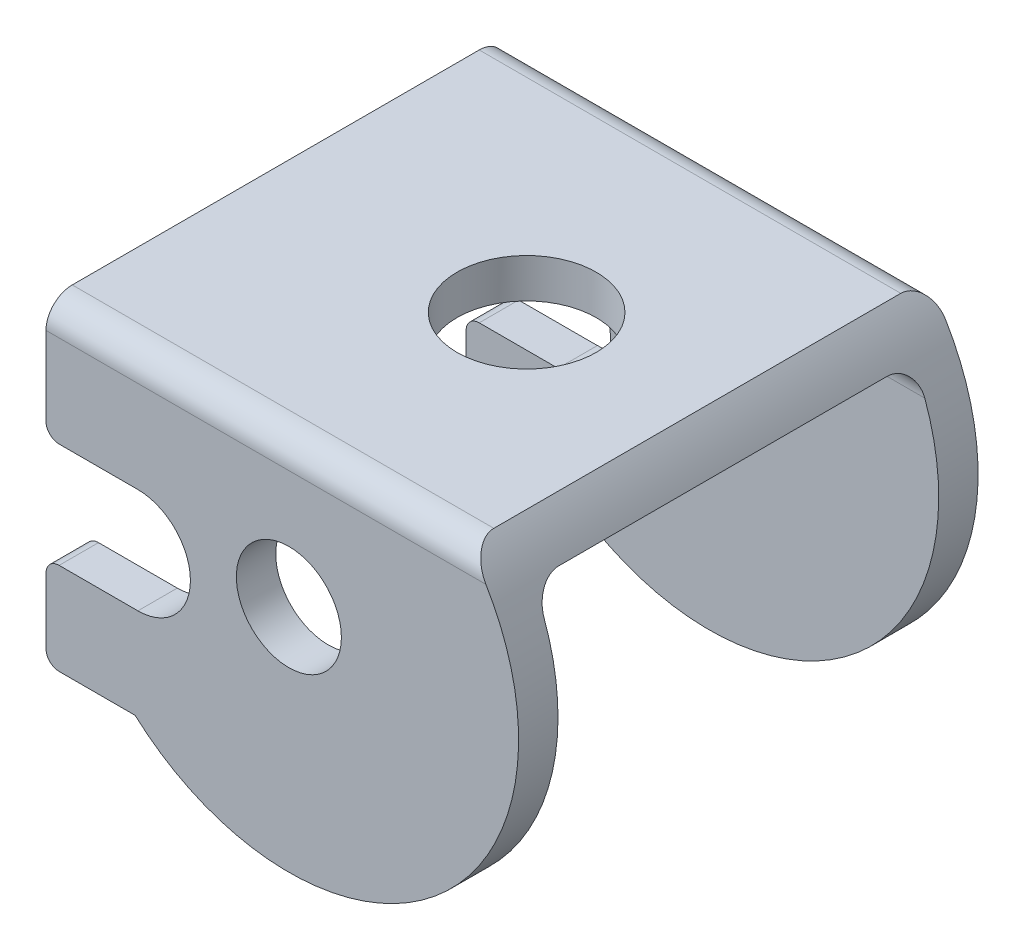
ISO-10303-21;
HEADER;
FILE_DESCRIPTION(('STEP AP214'),'2;1');
FILE_NAME('part.step','',(''),(''),'','','');
FILE_SCHEMA(('AUTOMOTIVE_DESIGN { 1 0 10303 214 1 1 1 1 }'));
ENDSEC;
DATA;
#1=APPLICATION_CONTEXT('core data for automotive mechanical design processes');
#2=APPLICATION_PROTOCOL_DEFINITION('international standard','automotive_design',2000,#1);
#3=PRODUCT_CONTEXT('',#1,'mechanical');
#4=PRODUCT('Part','Part','',(#3));
#5=PRODUCT_RELATED_PRODUCT_CATEGORY('part','',(#4));
#6=PRODUCT_DEFINITION_FORMATION('','',#4);
#7=PRODUCT_DEFINITION_CONTEXT('part definition',#1,'design');
#8=PRODUCT_DEFINITION('design','',#6,#7);
#9=PRODUCT_DEFINITION_SHAPE('','',#8);
#10=(LENGTH_UNIT() NAMED_UNIT(*) SI_UNIT(.MILLI.,.METRE.));
#11=(NAMED_UNIT(*) PLANE_ANGLE_UNIT() SI_UNIT($,.RADIAN.));
#12=(NAMED_UNIT(*) SI_UNIT($,.STERADIAN.) SOLID_ANGLE_UNIT());
#13=UNCERTAINTY_MEASURE_WITH_UNIT(LENGTH_MEASURE(1.E-05),#10,'distance_accuracy_value','');
#14=(GEOMETRIC_REPRESENTATION_CONTEXT(3) GLOBAL_UNCERTAINTY_ASSIGNED_CONTEXT((#13)) GLOBAL_UNIT_ASSIGNED_CONTEXT((#10,
#11,#12)) REPRESENTATION_CONTEXT('',''));
#15=CARTESIAN_POINT('',(0.,0.,0.));
#16=DIRECTION('',(0.,0.,1.));
#17=DIRECTION('',(1.,0.,0.));
#18=AXIS2_PLACEMENT_3D('',#15,#16,#17);
#19=CARTESIAN_POINT('',(-18.5,11.,17.5));
#20=DIRECTION('',(1.,0.,0.));
#21=DIRECTION('',(0.,1.,0.));
#22=AXIS2_PLACEMENT_3D('',#19,#20,#21);
#23=PLANE('',#22);
#24=DIRECTION('',(0.,-1.,0.));
#25=VECTOR('',#24,1.);
#26=CARTESIAN_POINT('',(-18.5,11.,-17.5));
#27=LINE('',#26,#25);
#28=CARTESIAN_POINT('',(-18.5,-7.,-17.5));
#29=VERTEX_POINT('',#28);
#30=CARTESIAN_POINT('',(-18.5,-12.,-17.5));
#31=VERTEX_POINT('',#30);
#32=EDGE_CURVE('E274',#29,#31,#27,.T.);
#33=ORIENTED_EDGE('',*,*,#32,.T.);
#34=DIRECTION('',(0.,0.,-1.));
#35=VECTOR('',#34,1.);
#36=CARTESIAN_POINT('',(-18.5,-12.,17.5));
#37=LINE('',#36,#35);
#38=CARTESIAN_POINT('',(-18.5,-12.,-14.5));
#39=VERTEX_POINT('',#38);
#40=EDGE_CURVE('E302',#31,#39,#37,.F.);
#41=ORIENTED_EDGE('',*,*,#40,.T.);
#42=DIRECTION('',(0.,-1.,0.));
#43=VECTOR('',#42,1.);
#44=CARTESIAN_POINT('',(-18.5,8.,-14.5));
#45=LINE('',#44,#43);
#46=CARTESIAN_POINT('',(-18.5,-7.,-14.5));
#47=VERTEX_POINT('',#46);
#48=EDGE_CURVE('E479',#47,#39,#45,.T.);
#49=ORIENTED_EDGE('',*,*,#48,.F.);
#50=DIRECTION('',(0.,0.,1.));
#51=VECTOR('',#50,1.);
#52=CARTESIAN_POINT('',(-18.5,-7.,17.5));
#53=LINE('',#52,#51);
#54=EDGE_CURVE('E300',#47,#29,#53,.F.);
#55=ORIENTED_EDGE('',*,*,#54,.T.);
#56=EDGE_LOOP('',(#33,#41,#49,#55));
#57=FACE_BOUND('',#56,.T.);
#58=ADVANCED_FACE('F33',(#57),#23,.F.);
#59=CARTESIAN_POINT('',(-18.5,-13.,17.5));
#60=DIRECTION('',(0.,1.,0.));
#61=DIRECTION('',(0.,0.,1.));
#62=AXIS2_PLACEMENT_3D('',#59,#60,#61);
#63=PLANE('',#62);
#64=DIRECTION('',(-1.,0.,0.));
#65=VECTOR('',#64,1.);
#66=CARTESIAN_POINT('',(-18.5,-13.,-14.5));
#67=LINE('',#66,#65);
#68=CARTESIAN_POINT('',(-11.71537451386,-13.,-14.5));
#69=VERTEX_POINT('',#68);
#70=CARTESIAN_POINT('',(-17.5,-13.,-14.5));
#71=VERTEX_POINT('',#70);
#72=EDGE_CURVE('E262',#69,#71,#67,.T.);
#73=ORIENTED_EDGE('',*,*,#72,.T.);
#74=DIRECTION('',(0.,0.,-1.));
#75=VECTOR('',#74,1.);
#76=CARTESIAN_POINT('',(-17.5,-13.,17.5));
#77=LINE('',#76,#75);
#78=CARTESIAN_POINT('',(-17.5,-13.,-17.5));
#79=VERTEX_POINT('',#78);
#80=EDGE_CURVE('E290',#71,#79,#77,.T.);
#81=ORIENTED_EDGE('',*,*,#80,.T.);
#82=DIRECTION('',(1.,0.,0.));
#83=VECTOR('',#82,1.);
#84=CARTESIAN_POINT('',(-18.5,-13.,-17.5));
#85=LINE('',#84,#83);
#86=CARTESIAN_POINT('',(-11.71537451386,-13.,-17.5));
#87=VERTEX_POINT('',#86);
#88=EDGE_CURVE('E273',#79,#87,#85,.T.);
#89=ORIENTED_EDGE('',*,*,#88,.T.);
#90=DIRECTION('',(0.,0.,-1.));
#91=VECTOR('',#90,1.);
#92=CARTESIAN_POINT('',(-11.71537451386,-13.,17.5));
#93=LINE('',#92,#91);
#94=EDGE_CURVE('E280',#69,#87,#93,.T.);
#95=ORIENTED_EDGE('',*,*,#94,.F.);
#96=EDGE_LOOP('',(#73,#81,#89,#95));
#97=FACE_BOUND('',#96,.T.);
#98=ADVANCED_FACE('F414',(#97),#63,.F.);
#99=CARTESIAN_POINT('',(0.,0.,-17.5));
#100=DIRECTION('',(0.,0.,1.));
#101=DIRECTION('',(1.,0.,0.));
#102=AXIS2_PLACEMENT_3D('',#99,#100,#101);
#103=CYLINDRICAL_SURFACE('',#102,4.);
#104=CARTESIAN_POINT('',(0.,0.,-14.5));
#105=DIRECTION('',(0.,0.,-1.));
#106=DIRECTION('',(0.,1.,0.));
#107=AXIS2_PLACEMENT_3D('',#104,#105,#106);
#108=CIRCLE('',#107,4.);
#109=CARTESIAN_POINT('',(0.,4.,-14.5));
#110=VERTEX_POINT('',#109);
#111=EDGE_CURVE('E500',#110,#110,#108,.F.);
#112=ORIENTED_EDGE('',*,*,#111,.T.);
#113=EDGE_LOOP('',(#112));
#114=FACE_BOUND('',#113,.T.);
#115=CARTESIAN_POINT('',(0.,0.,-17.5));
#116=DIRECTION('',(0.,0.,1.));
#117=DIRECTION('',(1.,0.,0.));
#118=AXIS2_PLACEMENT_3D('',#115,#116,#117);
#119=CIRCLE('',#118,4.);
#120=CARTESIAN_POINT('',(4.,0.,-17.5));
#121=VERTEX_POINT('',#120);
#122=EDGE_CURVE('E256',#121,#121,#119,.T.);
#123=ORIENTED_EDGE('',*,*,#122,.F.);
#124=EDGE_LOOP('',(#123));
#125=FACE_BOUND('',#124,.T.);
#126=ADVANCED_FACE('F421',(#114,#125),#103,.F.);
#127=CARTESIAN_POINT('',(-18.5,2.,-17.5));
#128=DIRECTION('',(0.,1.,0.));
#129=DIRECTION('',(0.,0.,1.));
#130=AXIS2_PLACEMENT_3D('',#127,#128,#129);
#131=PLANE('',#130);
#132=DIRECTION('',(-1.,0.,0.));
#133=VECTOR('',#132,1.);
#134=CARTESIAN_POINT('',(-18.5,2.,-14.5));
#135=LINE('',#134,#133);
#136=CARTESIAN_POINT('',(-11.5,2.,-14.5));
#137=VERTEX_POINT('',#136);
#138=CARTESIAN_POINT('',(-17.5,2.,-14.5));
#139=VERTEX_POINT('',#138);
#140=EDGE_CURVE('E497',#137,#139,#135,.T.);
#141=ORIENTED_EDGE('',*,*,#140,.T.);
#142=DIRECTION('',(0.,0.,1.));
#143=VECTOR('',#142,1.);
#144=CARTESIAN_POINT('',(-17.5,2.,-17.5));
#145=LINE('',#144,#143);
#146=CARTESIAN_POINT('',(-17.5,2.,-17.5));
#147=VERTEX_POINT('',#146);
#148=EDGE_CURVE('E339',#139,#147,#145,.F.);
#149=ORIENTED_EDGE('',*,*,#148,.T.);
#150=DIRECTION('',(-1.,0.,0.));
#151=VECTOR('',#150,1.);
#152=CARTESIAN_POINT('',(-18.5,2.,-17.5));
#153=LINE('',#152,#151);
#154=CARTESIAN_POINT('',(-11.5,2.,-17.5));
#155=VERTEX_POINT('',#154);
#156=EDGE_CURVE('E246',#155,#147,#153,.T.);
#157=ORIENTED_EDGE('',*,*,#156,.F.);
#158=DIRECTION('',(0.,0.,1.));
#159=VECTOR('',#158,1.);
#160=CARTESIAN_POINT('',(-11.5,2.,-17.5));
#161=LINE('',#160,#159);
#162=EDGE_CURVE('E254',#155,#137,#161,.T.);
#163=ORIENTED_EDGE('',*,*,#162,.T.);
#164=EDGE_LOOP('',(#141,#149,#157,#163));
#165=FACE_BOUND('',#164,.T.);
#166=ADVANCED_FACE('F559',(#165),#131,.F.);
#167=CARTESIAN_POINT('',(-11.5,-2.,-17.5));
#168=DIRECTION('',(0.,0.,1.));
#169=DIRECTION('',(1.,0.,0.));
#170=AXIS2_PLACEMENT_3D('',#167,#168,#169);
#171=CYLINDRICAL_SURFACE('',#170,4.);
#172=DIRECTION('',(0.,0.,1.));
#173=VECTOR('',#172,1.);
#174=CARTESIAN_POINT('',(-11.5,-6.,-17.5));
#175=LINE('',#174,#173);
#176=CARTESIAN_POINT('',(-11.5,-6.,-17.5));
#177=VERTEX_POINT('',#176);
#178=CARTESIAN_POINT('',(-11.5,-6.,-14.5));
#179=VERTEX_POINT('',#178);
#180=EDGE_CURVE('E245',#177,#179,#175,.T.);
#181=ORIENTED_EDGE('',*,*,#180,.T.);
#182=CARTESIAN_POINT('',(-11.5,-2.,-14.5));
#183=DIRECTION('',(0.,0.,-1.));
#184=DIRECTION('',(0.,1.,0.));
#185=AXIS2_PLACEMENT_3D('',#182,#183,#184);
#186=CIRCLE('',#185,4.);
#187=EDGE_CURVE('E494',#179,#137,#186,.F.);
#188=ORIENTED_EDGE('',*,*,#187,.T.);
#189=ORIENTED_EDGE('',*,*,#162,.F.);
#190=CARTESIAN_POINT('',(-11.5,-2.,-17.5));
#191=DIRECTION('',(0.,0.,1.));
#192=DIRECTION('',(1.,0.,0.));
#193=AXIS2_PLACEMENT_3D('',#190,#191,#192);
#194=CIRCLE('',#193,4.);
#195=EDGE_CURVE('E250',#177,#155,#194,.T.);
#196=ORIENTED_EDGE('',*,*,#195,.F.);
#197=EDGE_LOOP('',(#181,#188,#189,#196));
#198=FACE_BOUND('',#197,.T.);
#199=ADVANCED_FACE('F556',(#198),#171,.F.);
#200=CARTESIAN_POINT('',(-18.5,-6.,-17.5));
#201=DIRECTION('',(0.,-1.,0.));
#202=DIRECTION('',(0.,0.,-1.));
#203=AXIS2_PLACEMENT_3D('',#200,#201,#202);
#204=PLANE('',#203);
#205=DIRECTION('',(1.,0.,0.));
#206=VECTOR('',#205,1.);
#207=CARTESIAN_POINT('',(-18.5,-6.,-17.5));
#208=LINE('',#207,#206);
#209=CARTESIAN_POINT('',(-17.5,-6.,-17.5));
#210=VERTEX_POINT('',#209);
#211=EDGE_CURVE('E507',#210,#177,#208,.T.);
#212=ORIENTED_EDGE('',*,*,#211,.F.);
#213=DIRECTION('',(0.,0.,1.));
#214=VECTOR('',#213,1.);
#215=CARTESIAN_POINT('',(-17.5,-6.,-17.5));
#216=LINE('',#215,#214);
#217=CARTESIAN_POINT('',(-17.5,-6.,-14.5));
#218=VERTEX_POINT('',#217);
#219=EDGE_CURVE('E328',#210,#218,#216,.T.);
#220=ORIENTED_EDGE('',*,*,#219,.T.);
#221=DIRECTION('',(1.,0.,0.));
#222=VECTOR('',#221,1.);
#223=CARTESIAN_POINT('',(-18.5,-6.,-14.5));
#224=LINE('',#223,#222);
#225=EDGE_CURVE('E229',#218,#179,#224,.T.);
#226=ORIENTED_EDGE('',*,*,#225,.T.);
#227=ORIENTED_EDGE('',*,*,#180,.F.);
#228=EDGE_LOOP('',(#212,#220,#226,#227));
#229=FACE_BOUND('',#228,.T.);
#230=ADVANCED_FACE('F427',(#229),#204,.F.);
#231=DIRECTION('',(0.,0.,-1.));
#232=VECTOR('',#231,1.);
#233=CARTESIAN_POINT('',(-18.5,11.,17.5));
#234=LINE('',#233,#232);
#235=CARTESIAN_POINT('',(-18.5,11.,15.5));
#236=VERTEX_POINT('',#235);
#237=CARTESIAN_POINT('',(-18.5,11.,-15.5));
#238=VERTEX_POINT('',#237);
#239=EDGE_CURVE('E230',#236,#238,#234,.T.);
#240=ORIENTED_EDGE('',*,*,#239,.T.);
#241=CARTESIAN_POINT('',(-18.5,9.,-15.5));
#242=DIRECTION('',(1.,0.,0.));
#243=DIRECTION('',(0.,1.,0.));
#244=AXIS2_PLACEMENT_3D('',#241,#242,#243);
#245=CIRCLE('',#244,2.);
#246=CARTESIAN_POINT('',(-18.5,9.,-17.5));
#247=VERTEX_POINT('',#246);
#248=EDGE_CURVE('E360',#238,#247,#245,.F.);
#249=ORIENTED_EDGE('',*,*,#248,.T.);
#250=CARTESIAN_POINT('',(-18.5,3.,-17.5));
#251=VERTEX_POINT('',#250);
#252=EDGE_CURVE('E271',#247,#251,#27,.T.);
#253=ORIENTED_EDGE('',*,*,#252,.T.);
#254=DIRECTION('',(0.,0.,1.));
#255=VECTOR('',#254,1.);
#256=CARTESIAN_POINT('',(-18.5,3.,17.5));
#257=LINE('',#256,#255);
#258=CARTESIAN_POINT('',(-18.5,3.,-14.5));
#259=VERTEX_POINT('',#258);
#260=EDGE_CURVE('E336',#251,#259,#257,.T.);
#261=ORIENTED_EDGE('',*,*,#260,.T.);
#262=CARTESIAN_POINT('',(-18.5,6.,-14.5));
#263=VERTEX_POINT('',#262);
#264=EDGE_CURVE('E475',#263,#259,#45,.T.);
#265=ORIENTED_EDGE('',*,*,#264,.F.);
#266=CARTESIAN_POINT('',(-18.5,6.,-12.5));
#267=DIRECTION('',(1.,0.,0.));
#268=DIRECTION('',(0.,1.,0.));
#269=AXIS2_PLACEMENT_3D('',#266,#267,#268);
#270=CIRCLE('',#269,2.);
#271=CARTESIAN_POINT('',(-18.5,8.,-12.5));
#272=VERTEX_POINT('',#271);
#273=EDGE_CURVE('E392',#263,#272,#270,.T.);
#274=ORIENTED_EDGE('',*,*,#273,.T.);
#275=DIRECTION('',(0.,0.,-1.));
#276=VECTOR('',#275,1.);
#277=CARTESIAN_POINT('',(-18.5,8.,-14.5));
#278=LINE('',#277,#276);
#279=CARTESIAN_POINT('',(-18.5,8.,12.5));
#280=VERTEX_POINT('',#279);
#281=EDGE_CURVE('E240',#280,#272,#278,.T.);
#282=ORIENTED_EDGE('',*,*,#281,.F.);
#283=CARTESIAN_POINT('',(-18.5,6.,12.5));
#284=DIRECTION('',(1.,0.,0.));
#285=DIRECTION('',(0.,1.,0.));
#286=AXIS2_PLACEMENT_3D('',#283,#284,#285);
#287=CIRCLE('',#286,2.);
#288=CARTESIAN_POINT('',(-18.5,6.,14.5));
#289=VERTEX_POINT('',#288);
#290=EDGE_CURVE('E47',#280,#289,#287,.T.);
#291=ORIENTED_EDGE('',*,*,#290,.T.);
#292=DIRECTION('',(0.,1.,0.));
#293=VECTOR('',#292,1.);
#294=CARTESIAN_POINT('',(-18.5,8.,14.5));
#295=LINE('',#294,#293);
#296=CARTESIAN_POINT('',(-18.5,3.,14.5));
#297=VERTEX_POINT('',#296);
#298=EDGE_CURVE('E443',#297,#289,#295,.T.);
#299=ORIENTED_EDGE('',*,*,#298,.F.);
#300=DIRECTION('',(0.,0.,1.));
#301=VECTOR('',#300,1.);
#302=CARTESIAN_POINT('',(-18.5,3.,17.5));
#303=LINE('',#302,#301);
#304=CARTESIAN_POINT('',(-18.5,3.,17.5));
#305=VERTEX_POINT('',#304);
#306=EDGE_CURVE('E333',#297,#305,#303,.T.);
#307=ORIENTED_EDGE('',*,*,#306,.T.);
#308=DIRECTION('',(0.,-1.,0.));
#309=VECTOR('',#308,1.);
#310=CARTESIAN_POINT('',(-18.5,11.,17.5));
#311=LINE('',#310,#309);
#312=CARTESIAN_POINT('',(-18.5,9.,17.5));
#313=VERTEX_POINT('',#312);
#314=EDGE_CURVE('E263',#313,#305,#311,.T.);
#315=ORIENTED_EDGE('',*,*,#314,.F.);
#316=CARTESIAN_POINT('',(-18.5,9.,15.5));
#317=DIRECTION('',(1.,0.,0.));
#318=DIRECTION('',(0.,1.,0.));
#319=AXIS2_PLACEMENT_3D('',#316,#317,#318);
#320=CIRCLE('',#319,2.);
#321=EDGE_CURVE('E358',#313,#236,#320,.F.);
#322=ORIENTED_EDGE('',*,*,#321,.T.);
#323=EDGE_LOOP('',(#240,#249,#253,#261,#265,#274,#282,#291,#299,#307,#315,#322));
#324=FACE_BOUND('',#323,.T.);
#325=ADVANCED_FACE('F416',(#324),#23,.F.);
#326=CARTESIAN_POINT('',(-18.5,11.,17.5));
#327=DIRECTION('',(0.,-1.,0.));
#328=DIRECTION('',(0.,0.,-1.));
#329=AXIS2_PLACEMENT_3D('',#326,#327,#328);
#330=PLANE('',#329);
#331=CARTESIAN_POINT('',(0.610657588816201,11.,0.));
#332=DIRECTION('',(0.,1.,0.));
#333=DIRECTION('',(0.,0.,1.));
#334=AXIS2_PLACEMENT_3D('',#331,#332,#333);
#335=CIRCLE('',#334,5.3);
#336=CARTESIAN_POINT('',(0.610657588816201,11.,5.3));
#337=VERTEX_POINT('',#336);
#338=EDGE_CURVE('E793',#337,#337,#335,.T.);
#339=ORIENTED_EDGE('',*,*,#338,.F.);
#340=EDGE_LOOP('',(#339));
#341=FACE_BOUND('',#340,.T.);
#342=DIRECTION('',(0.,0.,-1.));
#343=VECTOR('',#342,1.);
#344=CARTESIAN_POINT('',(13.6106575888162,11.,17.5));
#345=LINE('',#344,#343);
#346=CARTESIAN_POINT('',(13.6106575888162,11.,15.5));
#347=VERTEX_POINT('',#346);
#348=CARTESIAN_POINT('',(13.6106575888162,11.,-15.5));
#349=VERTEX_POINT('',#348);
#350=EDGE_CURVE('E270',#347,#349,#345,.T.);
#351=ORIENTED_EDGE('',*,*,#350,.T.);
#352=DIRECTION('',(-1.,0.,0.));
#353=VECTOR('',#352,1.);
#354=CARTESIAN_POINT('',(-18.5,11.,-15.5));
#355=LINE('',#354,#353);
#356=EDGE_CURVE('E355',#349,#238,#355,.T.);
#357=ORIENTED_EDGE('',*,*,#356,.T.);
#358=ORIENTED_EDGE('',*,*,#239,.F.);
#359=DIRECTION('',(-1.,0.,0.));
#360=VECTOR('',#359,1.);
#361=CARTESIAN_POINT('',(13.6106575888162,11.,15.5));
#362=LINE('',#361,#360);
#363=EDGE_CURVE('E353',#236,#347,#362,.F.);
#364=ORIENTED_EDGE('',*,*,#363,.T.);
#365=EDGE_LOOP('',(#351,#357,#358,#364));
#366=FACE_BOUND('',#365,.T.);
#367=ADVANCED_FACE('F426',(#341,#366),#330,.F.);
#368=CARTESIAN_POINT('',(-18.5,-12.,14.5));
#369=VERTEX_POINT('',#368);
#370=CARTESIAN_POINT('',(-18.5,-7.,14.5));
#371=VERTEX_POINT('',#370);
#372=EDGE_CURVE('E438',#369,#371,#295,.T.);
#373=ORIENTED_EDGE('',*,*,#372,.F.);
#374=DIRECTION('',(0.,0.,-1.));
#375=VECTOR('',#374,1.);
#376=CARTESIAN_POINT('',(-18.5,-12.,17.5));
#377=LINE('',#376,#375);
#378=CARTESIAN_POINT('',(-18.5,-12.,17.5));
#379=VERTEX_POINT('',#378);
#380=EDGE_CURVE('E320',#369,#379,#377,.F.);
#381=ORIENTED_EDGE('',*,*,#380,.T.);
#382=CARTESIAN_POINT('',(-18.5,-7.,17.5));
#383=VERTEX_POINT('',#382);
#384=EDGE_CURVE('E266',#383,#379,#311,.T.);
#385=ORIENTED_EDGE('',*,*,#384,.F.);
#386=DIRECTION('',(0.,0.,1.));
#387=VECTOR('',#386,1.);
#388=CARTESIAN_POINT('',(-18.5,-7.,17.5));
#389=LINE('',#388,#387);
#390=EDGE_CURVE('E318',#383,#371,#389,.F.);
#391=ORIENTED_EDGE('',*,*,#390,.T.);
#392=EDGE_LOOP('',(#373,#381,#385,#391));
#393=FACE_BOUND('',#392,.T.);
#394=ADVANCED_FACE('F417',(#393),#23,.F.);
#395=DIRECTION('',(1.,0.,0.));
#396=VECTOR('',#395,1.);
#397=CARTESIAN_POINT('',(-18.5,-13.,17.5));
#398=LINE('',#397,#396);
#399=CARTESIAN_POINT('',(-17.5,-13.,17.5));
#400=VERTEX_POINT('',#399);
#401=CARTESIAN_POINT('',(-11.71537451386,-13.,17.5));
#402=VERTEX_POINT('',#401);
#403=EDGE_CURVE('E265',#400,#402,#398,.T.);
#404=ORIENTED_EDGE('',*,*,#403,.F.);
#405=DIRECTION('',(0.,0.,-1.));
#406=VECTOR('',#405,1.);
#407=CARTESIAN_POINT('',(-17.5,-13.,17.5));
#408=LINE('',#407,#406);
#409=CARTESIAN_POINT('',(-17.5,-13.,14.5));
#410=VERTEX_POINT('',#409);
#411=EDGE_CURVE('E310',#400,#410,#408,.T.);
#412=ORIENTED_EDGE('',*,*,#411,.T.);
#413=DIRECTION('',(1.,0.,0.));
#414=VECTOR('',#413,1.);
#415=CARTESIAN_POINT('',(-18.5,-13.,14.5));
#416=LINE('',#415,#414);
#417=CARTESIAN_POINT('',(-11.71537451386,-13.,14.5));
#418=VERTEX_POINT('',#417);
#419=EDGE_CURVE('E454',#410,#418,#416,.T.);
#420=ORIENTED_EDGE('',*,*,#419,.T.);
#421=EDGE_CURVE('E281',#402,#418,#93,.T.);
#422=ORIENTED_EDGE('',*,*,#421,.F.);
#423=EDGE_LOOP('',(#404,#412,#420,#422));
#424=FACE_BOUND('',#423,.T.);
#425=ADVANCED_FACE('F378',(#424),#63,.F.);
#426=CARTESIAN_POINT('',(0.,0.,17.5));
#427=DIRECTION('',(0.,0.,-1.));
#428=DIRECTION('',(-1.,0.,0.));
#429=AXIS2_PLACEMENT_3D('',#426,#427,#428);
#430=CYLINDRICAL_SURFACE('',#429,17.5);
#431=CARTESIAN_POINT('',(0.,0.,-17.5));
#432=DIRECTION('',(0.,0.,1.));
#433=DIRECTION('',(1.,0.,0.));
#434=AXIS2_PLACEMENT_3D('',#431,#432,#433);
#435=CIRCLE('',#434,17.5);
#436=CARTESIAN_POINT('',(15.0083310198036,9.,-17.5));
#437=VERTEX_POINT('',#436);
#438=EDGE_CURVE('E276',#87,#437,#435,.T.);
#439=ORIENTED_EDGE('',*,*,#438,.T.);
#440=CARTESIAN_POINT('',(15.0083310198036,9.,-17.5));
#441=CARTESIAN_POINT('',(14.9645534082728,9.07301034031166,-17.4999877795924));
#442=CARTESIAN_POINT('',(14.9202705373197,9.14563915729806,-17.4960011471963));
#443=CARTESIAN_POINT('',(14.8310412260911,9.28963812176121,-17.4802450340336));
#444=CARTESIAN_POINT('',(14.786094772489,9.36100824389683,-17.4684753967561));
#445=CARTESIAN_POINT('',(14.6504576699669,9.5729914135972,-17.4216287763982));
#446=CARTESIAN_POINT('',(14.5592902222138,9.71094314927927,-17.3750163714708));
#447=CARTESIAN_POINT('',(14.387830871648,9.9630082584165,-17.257895576401));
#448=CARTESIAN_POINT('',(14.3072985150232,10.0781496952952,-17.1899147371398));
#449=CARTESIAN_POINT('',(14.1521235423909,10.2949035045676,-17.0301192450205));
#450=CARTESIAN_POINT('',(14.077466567997,10.3965493043065,-16.9383652070003));
#451=CARTESIAN_POINT('',(13.9577809805876,10.5563945077046,-16.7600725509851));
#452=CARTESIAN_POINT('',(13.9102457681383,10.6188598616597,-16.6790198213369));
#453=CARTESIAN_POINT('',(13.8230708086961,10.7320921473302,-16.5052697006159));
#454=CARTESIAN_POINT('',(13.7834222024338,10.782872215668,-16.4125855686076));
#455=CARTESIAN_POINT('',(13.7202099441553,10.8631502915543,-16.2326520536976));
#456=CARTESIAN_POINT('',(13.6950900453614,10.8947499943016,-16.146889304263));
#457=CARTESIAN_POINT('',(13.6540086786241,10.9461931841439,-15.9698719301037));
#458=CARTESIAN_POINT('',(13.6380294385676,10.9660594868605,-15.8786283462376));
#459=CARTESIAN_POINT('',(13.6217478026285,10.9862667623627,-15.7387970052618));
#460=CARTESIAN_POINT('',(13.6176003801108,10.9914052871943,-15.6912877779798));
#461=CARTESIAN_POINT('',(13.61205222431,10.9982745431492,-15.595861750433));
#462=CARTESIAN_POINT('',(13.6106516878771,11.0000050300423,-15.5479449212053));
#463=CARTESIAN_POINT('',(13.6106575888162,11.,-15.5));
#464=B_SPLINE_CURVE_WITH_KNOTS('',3,(#440,#441,#442,#443,#444,#445,#446,#447,#448,#449,#450,
#451,#452,#453,#454,#455,#456,#457,#458,#459,#460,#461,#462,#463),.UNSPECIFIED.,.F.,.F.,(4,2,2,
2,2,2,2,2,2,2,2,4),(0.,0.255166405762982,0.510337942903821,1.0225224796022,1.48862069233795,
1.95354198706919,2.29080294644914,2.62768288361034,2.91089237958412,3.19354934537217,
3.33726869032789,3.48099833427564),.UNSPECIFIED.);
#465=EDGE_CURVE('E367',#437,#349,#464,.T.);
#466=ORIENTED_EDGE('',*,*,#465,.T.);
#467=ORIENTED_EDGE('',*,*,#350,.F.);
#468=CARTESIAN_POINT('',(13.6106575888162,11.,15.5));
#469=CARTESIAN_POINT('',(13.6106468465772,11.0000105496757,15.5479831027174));
#470=CARTESIAN_POINT('',(13.612052825652,10.9982735696029,15.5959582129971));
#471=CARTESIAN_POINT('',(13.6176160621449,10.9913860974259,15.6914713559368));
#472=CARTESIAN_POINT('',(13.6217715019022,10.9862378604908,15.7390096563335));
#473=CARTESIAN_POINT('',(13.6327113219535,10.9726593357704,15.8329458300312));
#474=CARTESIAN_POINT('',(13.6394761450401,10.9642534616704,15.8793495189758));
#475=CARTESIAN_POINT('',(13.6554859009043,10.9443075799741,15.9710330917056));
#476=CARTESIAN_POINT('',(13.6647311303355,10.9327671974922,16.0163128403609));
#477=CARTESIAN_POINT('',(13.6958801767708,10.8937586048742,16.149796509575));
#478=CARTESIAN_POINT('',(13.7212352991921,10.86185641496,16.2359561179349));
#479=CARTESIAN_POINT('',(13.7795210316588,10.7878179753847,16.4010768693606));
#480=CARTESIAN_POINT('',(13.8124674681899,10.7456603346193,16.4800224855417));
#481=CARTESIAN_POINT('',(13.8961311393038,10.6373685181619,16.6544457657481));
#482=CARTESIAN_POINT('',(13.9491243873168,10.5679135208077,16.7467775076532));
#483=CARTESIAN_POINT('',(14.0621750140902,10.4170121619937,16.9159689606591));
#484=CARTESIAN_POINT('',(14.1222404973257,10.3355520157261,16.9928106420147));
#485=CARTESIAN_POINT('',(14.2475401181812,10.1621441794972,17.131531759706));
#486=CARTESIAN_POINT('',(14.3128295414652,10.0700779788351,17.1932118726125));
#487=CARTESIAN_POINT('',(14.4457337603079,9.87848178903065,17.3000838271274));
#488=CARTESIAN_POINT('',(14.5133478274605,9.77895412653636,17.3452807829782));
#489=CARTESIAN_POINT('',(14.6529252405824,9.56861801634556,17.420895665632));
#490=CARTESIAN_POINT('',(14.7249233291505,9.45749020367269,17.4503644397463));
#491=CARTESIAN_POINT('',(14.867855909088,9.23120736534117,17.4899014988013));
#492=CARTESIAN_POINT('',(14.9387905636612,9.11605296686619,17.4999727915221));
#493=CARTESIAN_POINT('',(15.0083310198036,9.,17.5));
#494=B_SPLINE_CURVE_WITH_KNOTS('',3,(#468,#469,#470,#471,#472,#473,#474,#475,#476,#477,#478,
#479,#480,#481,#482,#483,#484,#485,#486,#487,#488,#489,#490,#491,#492,#493),.UNSPECIFIED.,.F.,
.F.,(4,2,2,2,2,2,2,2,2,2,2,2,4),(0.,0.143884224286708,0.287673422035193,0.430405234278488,
0.573154124692177,0.857713271600705,1.14287112723005,1.52216569895172,1.90189923553747,
2.28638593763024,2.67075324302675,3.07625267937024,3.48168923376816),.UNSPECIFIED.);
#495=CARTESIAN_POINT('',(15.0083310198036,9.,17.5));
#496=VERTEX_POINT('',#495);
#497=EDGE_CURVE('E54',#347,#496,#494,.T.);
#498=ORIENTED_EDGE('',*,*,#497,.T.);
#499=CARTESIAN_POINT('',(0.,0.,17.5));
#500=DIRECTION('',(0.,0.,1.));
#501=DIRECTION('',(1.,0.,0.));
#502=AXIS2_PLACEMENT_3D('',#499,#500,#501);
#503=CIRCLE('',#502,17.5);
#504=EDGE_CURVE('E268',#402,#496,#503,.T.);
#505=ORIENTED_EDGE('',*,*,#504,.F.);
#506=ORIENTED_EDGE('',*,*,#421,.T.);
#507=CARTESIAN_POINT('',(0.,0.,14.5));
#508=DIRECTION('',(0.,0.,1.));
#509=DIRECTION('',(0.,-1.,0.));
#510=AXIS2_PLACEMENT_3D('',#507,#508,#509);
#511=CIRCLE('',#510,17.5);
#512=CARTESIAN_POINT('',(16.4392822227736,6.00000000000001,14.5));
#513=VERTEX_POINT('',#512);
#514=EDGE_CURVE('E491',#418,#513,#511,.T.);
#515=ORIENTED_EDGE('',*,*,#514,.T.);
#516=CARTESIAN_POINT('',(16.4392822227736,6.00000000000001,14.5));
#517=CARTESIAN_POINT('',(16.4172269109751,6.06043468401717,14.499997609874));
#518=CARTESIAN_POINT('',(16.3948462847981,6.12071319611466,14.497259637975));
#519=CARTESIAN_POINT('',(16.3495926634499,6.24058600612827,14.4863898051146));
#520=CARTESIAN_POINT('',(16.3267197394568,6.30018040107121,14.478258718907));
#521=CARTESIAN_POINT('',(16.2576284887618,6.47730756746203,14.4459084145596));
#522=CARTESIAN_POINT('',(16.2109004937225,6.59328601766114,14.4137318837466));
#523=CARTESIAN_POINT('',(16.1178092334575,6.81769930699886,14.3291440712994));
#524=CARTESIAN_POINT('',(16.0714459793578,6.92613391680953,14.2767321748399));
#525=CARTESIAN_POINT('',(15.9809058946653,7.13255518813414,14.1528157800091));
#526=CARTESIAN_POINT('',(15.9367289912619,7.23054219770348,14.0813119179532));
#527=CARTESIAN_POINT('',(15.8530184381338,7.41227033070096,13.9212774574792));
#528=CARTESIAN_POINT('',(15.8134501941525,7.49612003773127,13.8328889225033));
#529=CARTESIAN_POINT('',(15.740856959433,7.64738352203996,13.6406480943489));
#530=CARTESIAN_POINT('',(15.7078301546021,7.71480185731765,13.5368001024689));
#531=CARTESIAN_POINT('',(15.6529625975252,7.82549085156232,13.3250345890196));
#532=CARTESIAN_POINT('',(15.6304469134525,7.87024243681698,13.2180776386848));
#533=CARTESIAN_POINT('',(15.6036653733771,7.92313101281914,13.0522208374665));
#534=CARTESIAN_POINT('',(15.595905420202,7.93838378788618,12.9960578107998));
#535=CARTESIAN_POINT('',(15.5828537036214,7.96397388312797,12.8823524675279));
#536=CARTESIAN_POINT('',(15.5775604856849,7.97431410010354,12.8248109848422));
#537=CARTESIAN_POINT('',(15.5705124933069,7.98806522270469,12.722676621708));
#538=CARTESIAN_POINT('',(15.5682154991806,7.99253939452775,12.6782599258364));
#539=CARTESIAN_POINT('',(15.5651499914437,7.99850664336416,12.5892312306071));
#540=CARTESIAN_POINT('',(15.5643795415305,8.00000349688347,12.5446195506892));
#541=CARTESIAN_POINT('',(15.5643824162734,8.00000000000001,12.5));
#542=B_SPLINE_CURVE_WITH_KNOTS('',3,(#516,#517,#518,#519,#520,#521,#522,#523,#524,#525,#526,
#527,#528,#529,#530,#531,#532,#533,#534,#535,#536,#537,#538,#539,#540,#541),.UNSPECIFIED.,.F.,
.F.,(4,2,2,2,2,2,2,2,2,2,2,2,4),(0.,0.19287380689744,0.385719912293615,0.771091411913085,
1.15647462146591,1.54184498819906,1.92410539491802,2.30625964307381,2.65839273320123,
2.83430314760535,3.01010970331713,3.14409168810323,3.27790361809354),.UNSPECIFIED.);
#543=CARTESIAN_POINT('',(15.5643824162734,8.00000000000001,12.5));
#544=VERTEX_POINT('',#543);
#545=EDGE_CURVE('E11',#513,#544,#542,.T.);
#546=ORIENTED_EDGE('',*,*,#545,.T.);
#547=DIRECTION('',(0.,0.,-1.));
#548=VECTOR('',#547,1.);
#549=CARTESIAN_POINT('',(15.5643824162734,8.00000000000001,17.5));
#550=LINE('',#549,#548);
#551=CARTESIAN_POINT('',(15.5643824162734,8.00000000000001,-12.5));
#552=VERTEX_POINT('',#551);
#553=EDGE_CURVE('E287',#544,#552,#550,.T.);
#554=ORIENTED_EDGE('',*,*,#553,.T.);
#555=CARTESIAN_POINT('',(15.5643824162734,8.00000000000001,-12.5));
#556=CARTESIAN_POINT('',(15.5643760249066,8.00000836466986,-12.5521306548815));
#557=CARTESIAN_POINT('',(15.565429880145,7.99796201184006,-12.604256115764));
#558=CARTESIAN_POINT('',(15.5696096602748,7.98982435223977,-12.708089719192));
#559=CARTESIAN_POINT('',(15.5727348911933,7.98373440019482,-12.7597979956361));
#560=CARTESIAN_POINT('',(15.5809922784606,7.96760671825372,-12.8622175990559));
#561=CARTESIAN_POINT('',(15.5861162430549,7.9575851012255,-12.9129321190703));
#562=CARTESIAN_POINT('',(15.5982769913274,7.93372128327986,-13.0132075152547));
#563=CARTESIAN_POINT('',(15.6053138633619,7.91987890588284,-13.0627683380213));
#564=CARTESIAN_POINT('',(15.6291166824584,7.87286211127509,-13.2091223580708));
#565=CARTESIAN_POINT('',(15.6485903833621,7.83416813889131,-13.3037732810296));
#566=CARTESIAN_POINT('',(15.6936028001465,7.74360212588611,-13.4849581075532));
#567=CARTESIAN_POINT('',(15.7191465163693,7.6917192180454,-13.5714852364973));
#568=CARTESIAN_POINT('',(15.7764504612658,7.57351516283824,-13.7389844261443));
#569=CARTESIAN_POINT('',(15.8084625488592,7.50658942993085,-13.8194430964984));
#570=CARTESIAN_POINT('',(15.8762961635755,7.36203745191937,-13.9682046255802));
#571=CARTESIAN_POINT('',(15.9121191010112,7.28440724215061,-14.0365029588552));
#572=CARTESIAN_POINT('',(15.9899773355718,7.11199239453678,-14.1662110231765));
#573=CARTESIAN_POINT('',(16.0322739184856,7.01626607399516,-14.2262138104442));
#574=CARTESIAN_POINT('',(16.1181873612254,6.81658755474057,-14.3291550283034));
#575=CARTESIAN_POINT('',(16.1618044015195,6.71263422847257,-14.3720911149391));
#576=CARTESIAN_POINT('',(16.2450984113127,6.50828720619884,-14.4370357680346));
#577=CARTESIAN_POINT('',(16.2847877661767,6.40837169341418,-14.4605410157883));
#578=CARTESIAN_POINT('',(16.3630793985492,6.20577787446,-14.4920303350473));
#579=CARTESIAN_POINT('',(16.4016822452881,6.10310107224752,-14.500022688881));
#580=CARTESIAN_POINT('',(16.4392822227736,6.00000000000001,-14.5));
#581=B_SPLINE_CURVE_WITH_KNOTS('',3,(#555,#556,#557,#558,#559,#560,#561,#562,#563,#564,#565,
#566,#567,#568,#569,#570,#571,#572,#573,#574,#575,#576,#577,#578,#579,#580),.UNSPECIFIED.,.F.,
.F.,(4,2,2,2,2,2,2,2,2,2,2,2,4),(0.,0.156332474129688,0.31261259865948,0.46825883167714,
0.623912255143662,0.93465870487193,1.2456620334067,1.57263497183098,1.89972933959439,
2.26008874467886,2.62049762475862,2.94952493935025,3.2783765380057),.UNSPECIFIED.);
#582=CARTESIAN_POINT('',(16.4392822227736,6.00000000000001,-14.5));
#583=VERTEX_POINT('',#582);
#584=EDGE_CURVE('E386',#552,#583,#581,.T.);
#585=ORIENTED_EDGE('',*,*,#584,.T.);
#586=CARTESIAN_POINT('',(0.,0.,-14.5));
#587=DIRECTION('',(0.,0.,-1.));
#588=DIRECTION('',(0.,1.,0.));
#589=AXIS2_PLACEMENT_3D('',#586,#587,#588);
#590=CIRCLE('',#589,17.5);
#591=EDGE_CURVE('E503',#583,#69,#590,.T.);
#592=ORIENTED_EDGE('',*,*,#591,.T.);
#593=ORIENTED_EDGE('',*,*,#94,.T.);
#594=EDGE_LOOP('',(#439,#466,#467,#498,#505,#506,#515,#546,#554,#585,#592,#593));
#595=FACE_BOUND('',#594,.T.);
#596=ADVANCED_FACE('F372',(#595),#430,.T.);
#597=CARTESIAN_POINT('',(0.,0.,17.5));
#598=DIRECTION('',(0.,0.,1.));
#599=DIRECTION('',(1.,0.,0.));
#600=AXIS2_PLACEMENT_3D('',#597,#598,#599);
#601=PLANE('',#600);
#602=ORIENTED_EDGE('',*,*,#504,.T.);
#603=DIRECTION('',(-1.,0.,0.));
#604=VECTOR('',#603,1.);
#605=CARTESIAN_POINT('',(-18.5,9.,17.5));
#606=LINE('',#605,#604);
#607=EDGE_CURVE('E459',#496,#313,#606,.T.);
#608=ORIENTED_EDGE('',*,*,#607,.T.);
#609=ORIENTED_EDGE('',*,*,#314,.T.);
#610=CARTESIAN_POINT('',(-17.5,3.,17.5));
#611=DIRECTION('',(0.,0.,1.));
#612=DIRECTION('',(1.,0.,0.));
#613=AXIS2_PLACEMENT_3D('',#610,#611,#612);
#614=CIRCLE('',#613,1.);
#615=CARTESIAN_POINT('',(-17.5,2.,17.5));
#616=VERTEX_POINT('',#615);
#617=EDGE_CURVE('E322',#305,#616,#614,.T.);
#618=ORIENTED_EDGE('',*,*,#617,.T.);
#619=DIRECTION('',(-1.,0.,0.));
#620=VECTOR('',#619,1.);
#621=CARTESIAN_POINT('',(-18.5,2.,17.5));
#622=LINE('',#621,#620);
#623=CARTESIAN_POINT('',(-11.5,2.,17.5));
#624=VERTEX_POINT('',#623);
#625=EDGE_CURVE('E509',#624,#616,#622,.T.);
#626=ORIENTED_EDGE('',*,*,#625,.F.);
#627=CARTESIAN_POINT('',(-11.5,-2.,17.5));
#628=DIRECTION('',(0.,0.,1.));
#629=DIRECTION('',(1.,0.,0.));
#630=AXIS2_PLACEMENT_3D('',#627,#628,#629);
#631=CIRCLE('',#630,4.);
#632=CARTESIAN_POINT('',(-11.5,-6.,17.5));
#633=VERTEX_POINT('',#632);
#634=EDGE_CURVE('E512',#633,#624,#631,.T.);
#635=ORIENTED_EDGE('',*,*,#634,.F.);
#636=DIRECTION('',(1.,0.,0.));
#637=VECTOR('',#636,1.);
#638=CARTESIAN_POINT('',(-18.5,-6.,17.5));
#639=LINE('',#638,#637);
#640=CARTESIAN_POINT('',(-17.5,-6.,17.5));
#641=VERTEX_POINT('',#640);
#642=EDGE_CURVE('E244',#641,#633,#639,.T.);
#643=ORIENTED_EDGE('',*,*,#642,.F.);
#644=CARTESIAN_POINT('',(-17.5,-7.,17.5));
#645=DIRECTION('',(0.,0.,1.));
#646=DIRECTION('',(1.,0.,0.));
#647=AXIS2_PLACEMENT_3D('',#644,#645,#646);
#648=CIRCLE('',#647,1.);
#649=EDGE_CURVE('E324',#641,#383,#648,.T.);
#650=ORIENTED_EDGE('',*,*,#649,.T.);
#651=ORIENTED_EDGE('',*,*,#384,.T.);
#652=CARTESIAN_POINT('',(-17.5,-12.,17.5));
#653=DIRECTION('',(0.,0.,1.));
#654=DIRECTION('',(1.,0.,0.));
#655=AXIS2_PLACEMENT_3D('',#652,#653,#654);
#656=CIRCLE('',#655,1.);
#657=EDGE_CURVE('E326',#379,#400,#656,.T.);
#658=ORIENTED_EDGE('',*,*,#657,.T.);
#659=ORIENTED_EDGE('',*,*,#403,.T.);
#660=EDGE_LOOP('',(#602,#608,#609,#618,#626,#635,#643,#650,#651,#658,#659));
#661=FACE_BOUND('',#660,.T.);
#662=CARTESIAN_POINT('',(0.,0.,17.5));
#663=DIRECTION('',(0.,0.,1.));
#664=DIRECTION('',(1.,0.,0.));
#665=AXIS2_PLACEMENT_3D('',#662,#663,#664);
#666=CIRCLE('',#665,4.);
#667=CARTESIAN_POINT('',(4.,0.,17.5));
#668=VERTEX_POINT('',#667);
#669=EDGE_CURVE('E259',#668,#668,#666,.T.);
#670=ORIENTED_EDGE('',*,*,#669,.F.);
#671=EDGE_LOOP('',(#670));
#672=FACE_BOUND('',#671,.T.);
#673=ADVANCED_FACE('F377',(#661,#672),#601,.T.);
#674=CARTESIAN_POINT('',(0.,0.,-17.5));
#675=DIRECTION('',(0.,0.,1.));
#676=DIRECTION('',(1.,0.,0.));
#677=AXIS2_PLACEMENT_3D('',#674,#675,#676);
#678=PLANE('',#677);
#679=ORIENTED_EDGE('',*,*,#122,.T.);
#680=EDGE_LOOP('',(#679));
#681=FACE_BOUND('',#680,.T.);
#682=ORIENTED_EDGE('',*,*,#252,.F.);
#683=DIRECTION('',(-1.,0.,0.));
#684=VECTOR('',#683,1.);
#685=CARTESIAN_POINT('',(0.,9.,-17.5));
#686=LINE('',#685,#684);
#687=EDGE_CURVE('E62',#247,#437,#686,.F.);
#688=ORIENTED_EDGE('',*,*,#687,.T.);
#689=ORIENTED_EDGE('',*,*,#438,.F.);
#690=ORIENTED_EDGE('',*,*,#88,.F.);
#691=CARTESIAN_POINT('',(-17.5,-12.,-17.5));
#692=DIRECTION('',(0.,0.,1.));
#693=DIRECTION('',(1.,0.,0.));
#694=AXIS2_PLACEMENT_3D('',#691,#692,#693);
#695=CIRCLE('',#694,1.);
#696=EDGE_CURVE('E298',#79,#31,#695,.F.);
#697=ORIENTED_EDGE('',*,*,#696,.T.);
#698=ORIENTED_EDGE('',*,*,#32,.F.);
#699=CARTESIAN_POINT('',(-17.5,-7.,-17.5));
#700=DIRECTION('',(0.,0.,1.));
#701=DIRECTION('',(1.,0.,0.));
#702=AXIS2_PLACEMENT_3D('',#699,#700,#701);
#703=CIRCLE('',#702,1.);
#704=EDGE_CURVE('E296',#29,#210,#703,.F.);
#705=ORIENTED_EDGE('',*,*,#704,.T.);
#706=ORIENTED_EDGE('',*,*,#211,.T.);
#707=ORIENTED_EDGE('',*,*,#195,.T.);
#708=ORIENTED_EDGE('',*,*,#156,.T.);
#709=CARTESIAN_POINT('',(-17.5,3.,-17.5));
#710=DIRECTION('',(0.,0.,1.));
#711=DIRECTION('',(1.,0.,0.));
#712=AXIS2_PLACEMENT_3D('',#709,#710,#711);
#713=CIRCLE('',#712,1.);
#714=EDGE_CURVE('E293',#147,#251,#713,.F.);
#715=ORIENTED_EDGE('',*,*,#714,.T.);
#716=EDGE_LOOP('',(#682,#688,#689,#690,#697,#698,#705,#706,#707,#708,#715));
#717=FACE_BOUND('',#716,.T.);
#718=ADVANCED_FACE('F379',(#681,#717),#678,.F.);
#719=CARTESIAN_POINT('',(0.,0.,14.5));
#720=DIRECTION('',(0.,0.,1.));
#721=DIRECTION('',(0.,-1.,0.));
#722=AXIS2_PLACEMENT_3D('',#719,#720,#721);
#723=CIRCLE('',#722,4.);
#724=CARTESIAN_POINT('',(0.,-4.,14.5));
#725=VERTEX_POINT('',#724);
#726=EDGE_CURVE('E488',#725,#725,#723,.F.);
#727=ORIENTED_EDGE('',*,*,#726,.T.);
#728=EDGE_LOOP('',(#727));
#729=FACE_BOUND('',#728,.T.);
#730=ORIENTED_EDGE('',*,*,#669,.T.);
#731=EDGE_LOOP('',(#730));
#732=FACE_BOUND('',#731,.T.);
#733=ADVANCED_FACE('F569',(#729,#732),#103,.F.);
#734=ORIENTED_EDGE('',*,*,#625,.T.);
#735=DIRECTION('',(0.,0.,1.));
#736=VECTOR('',#735,1.);
#737=CARTESIAN_POINT('',(-17.5,2.,-17.5));
#738=LINE('',#737,#736);
#739=CARTESIAN_POINT('',(-17.5,2.,14.5));
#740=VERTEX_POINT('',#739);
#741=EDGE_CURVE('E341',#616,#740,#738,.F.);
#742=ORIENTED_EDGE('',*,*,#741,.T.);
#743=DIRECTION('',(1.,0.,0.));
#744=VECTOR('',#743,1.);
#745=CARTESIAN_POINT('',(-18.5,2.,14.5));
#746=LINE('',#745,#744);
#747=CARTESIAN_POINT('',(-11.5,2.,14.5));
#748=VERTEX_POINT('',#747);
#749=EDGE_CURVE('E239',#740,#748,#746,.T.);
#750=ORIENTED_EDGE('',*,*,#749,.T.);
#751=EDGE_CURVE('E238',#748,#624,#161,.T.);
#752=ORIENTED_EDGE('',*,*,#751,.T.);
#753=EDGE_LOOP('',(#734,#742,#750,#752));
#754=FACE_BOUND('',#753,.T.);
#755=ADVANCED_FACE('F517',(#754),#131,.F.);
#756=ORIENTED_EDGE('',*,*,#751,.F.);
#757=CARTESIAN_POINT('',(-11.5,-2.,14.5));
#758=DIRECTION('',(0.,0.,1.));
#759=DIRECTION('',(0.,-1.,0.));
#760=AXIS2_PLACEMENT_3D('',#757,#758,#759);
#761=CIRCLE('',#760,4.);
#762=CARTESIAN_POINT('',(-11.5,-6.,14.5));
#763=VERTEX_POINT('',#762);
#764=EDGE_CURVE('E220',#748,#763,#761,.F.);
#765=ORIENTED_EDGE('',*,*,#764,.T.);
#766=EDGE_CURVE('E236',#763,#633,#175,.T.);
#767=ORIENTED_EDGE('',*,*,#766,.T.);
#768=ORIENTED_EDGE('',*,*,#634,.T.);
#769=EDGE_LOOP('',(#756,#765,#767,#768));
#770=FACE_BOUND('',#769,.T.);
#771=ADVANCED_FACE('F234',(#770),#171,.F.);
#772=DIRECTION('',(-1.,0.,0.));
#773=VECTOR('',#772,1.);
#774=CARTESIAN_POINT('',(-18.5,-6.,14.5));
#775=LINE('',#774,#773);
#776=CARTESIAN_POINT('',(-17.5,-6.,14.5));
#777=VERTEX_POINT('',#776);
#778=EDGE_CURVE('E215',#763,#777,#775,.T.);
#779=ORIENTED_EDGE('',*,*,#778,.T.);
#780=DIRECTION('',(0.,0.,1.));
#781=VECTOR('',#780,1.);
#782=CARTESIAN_POINT('',(-17.5,-6.,-17.5));
#783=LINE('',#782,#781);
#784=EDGE_CURVE('E331',#777,#641,#783,.T.);
#785=ORIENTED_EDGE('',*,*,#784,.T.);
#786=ORIENTED_EDGE('',*,*,#642,.T.);
#787=ORIENTED_EDGE('',*,*,#766,.F.);
#788=EDGE_LOOP('',(#779,#785,#786,#787));
#789=FACE_BOUND('',#788,.T.);
#790=ADVANCED_FACE('F242',(#789),#204,.F.);
#791=CARTESIAN_POINT('',(17.5,8.00000000000001,-14.5));
#792=DIRECTION('',(0.,1.,0.));
#793=DIRECTION('',(-1.,0.,0.));
#794=AXIS2_PLACEMENT_3D('',#791,#792,#793);
#795=PLANE('',#794);
#796=CARTESIAN_POINT('',(0.610657588816201,8.,0.));
#797=DIRECTION('',(0.,1.,0.));
#798=DIRECTION('',(-1.,0.,0.));
#799=AXIS2_PLACEMENT_3D('',#796,#797,#798);
#800=CIRCLE('',#799,5.3);
#801=CARTESIAN_POINT('',(-4.6893424111838,8.,0.));
#802=VERTEX_POINT('',#801);
#803=EDGE_CURVE('E482',#802,#802,#800,.F.);
#804=ORIENTED_EDGE('',*,*,#803,.F.);
#805=EDGE_LOOP('',(#804));
#806=FACE_BOUND('',#805,.T.);
#807=ORIENTED_EDGE('',*,*,#281,.T.);
#808=DIRECTION('',(-1.,0.,0.));
#809=VECTOR('',#808,1.);
#810=CARTESIAN_POINT('',(15.5643824162734,8.00000000000001,-12.5));
#811=LINE('',#810,#809);
#812=EDGE_CURVE('E349',#272,#552,#811,.F.);
#813=ORIENTED_EDGE('',*,*,#812,.T.);
#814=ORIENTED_EDGE('',*,*,#553,.F.);
#815=DIRECTION('',(-1.,0.,0.));
#816=VECTOR('',#815,1.);
#817=CARTESIAN_POINT('',(-18.5,8.,12.5));
#818=LINE('',#817,#816);
#819=EDGE_CURVE('E346',#544,#280,#818,.T.);
#820=ORIENTED_EDGE('',*,*,#819,.T.);
#821=EDGE_LOOP('',(#807,#813,#814,#820));
#822=FACE_BOUND('',#821,.T.);
#823=ADVANCED_FACE('F528',(#806,#822),#795,.F.);
#824=CARTESIAN_POINT('',(17.5,8.00000000000001,-14.5));
#825=DIRECTION('',(0.,0.,-1.));
#826=DIRECTION('',(0.,1.,0.));
#827=AXIS2_PLACEMENT_3D('',#824,#825,#826);
#828=PLANE('',#827);
#829=ORIENTED_EDGE('',*,*,#111,.F.);
#830=EDGE_LOOP('',(#829));
#831=FACE_BOUND('',#830,.T.);
#832=ORIENTED_EDGE('',*,*,#591,.F.);
#833=DIRECTION('',(-1.,0.,0.));
#834=VECTOR('',#833,1.);
#835=CARTESIAN_POINT('',(-18.5,6.,-14.5));
#836=LINE('',#835,#834);
#837=EDGE_CURVE('E343',#583,#263,#836,.T.);
#838=ORIENTED_EDGE('',*,*,#837,.T.);
#839=ORIENTED_EDGE('',*,*,#264,.T.);
#840=CARTESIAN_POINT('',(-17.5,3.,-14.5));
#841=DIRECTION('',(0.,0.,-1.));
#842=DIRECTION('',(0.,1.,0.));
#843=AXIS2_PLACEMENT_3D('',#840,#841,#842);
#844=CIRCLE('',#843,1.);
#845=EDGE_CURVE('E304',#259,#139,#844,.F.);
#846=ORIENTED_EDGE('',*,*,#845,.T.);
#847=ORIENTED_EDGE('',*,*,#140,.F.);
#848=ORIENTED_EDGE('',*,*,#187,.F.);
#849=ORIENTED_EDGE('',*,*,#225,.F.);
#850=CARTESIAN_POINT('',(-17.5,-7.,-14.5));
#851=DIRECTION('',(0.,0.,-1.));
#852=DIRECTION('',(0.,1.,0.));
#853=AXIS2_PLACEMENT_3D('',#850,#851,#852);
#854=CIRCLE('',#853,1.);
#855=EDGE_CURVE('E306',#218,#47,#854,.F.);
#856=ORIENTED_EDGE('',*,*,#855,.T.);
#857=ORIENTED_EDGE('',*,*,#48,.T.);
#858=CARTESIAN_POINT('',(-17.5,-12.,-14.5));
#859=DIRECTION('',(0.,0.,-1.));
#860=DIRECTION('',(0.,1.,0.));
#861=AXIS2_PLACEMENT_3D('',#858,#859,#860);
#862=CIRCLE('',#861,1.);
#863=EDGE_CURVE('E308',#39,#71,#862,.F.);
#864=ORIENTED_EDGE('',*,*,#863,.T.);
#865=ORIENTED_EDGE('',*,*,#72,.F.);
#866=EDGE_LOOP('',(#832,#838,#839,#846,#847,#848,#849,#856,#857,#864,#865));
#867=FACE_BOUND('',#866,.T.);
#868=ADVANCED_FACE('F533',(#831,#867),#828,.F.);
#869=CARTESIAN_POINT('',(17.5,8.00000000000001,14.5));
#870=DIRECTION('',(0.,0.,1.));
#871=DIRECTION('',(0.,-1.,0.));
#872=AXIS2_PLACEMENT_3D('',#869,#870,#871);
#873=PLANE('',#872);
#874=ORIENTED_EDGE('',*,*,#726,.F.);
#875=EDGE_LOOP('',(#874));
#876=FACE_BOUND('',#875,.T.);
#877=ORIENTED_EDGE('',*,*,#298,.T.);
#878=DIRECTION('',(-1.,0.,0.));
#879=VECTOR('',#878,1.);
#880=CARTESIAN_POINT('',(15.5643824162734,6.00000000000001,14.5));
#881=LINE('',#880,#879);
#882=EDGE_CURVE('E351',#289,#513,#881,.F.);
#883=ORIENTED_EDGE('',*,*,#882,.T.);
#884=ORIENTED_EDGE('',*,*,#514,.F.);
#885=ORIENTED_EDGE('',*,*,#419,.F.);
#886=CARTESIAN_POINT('',(-17.5,-12.,14.5));
#887=DIRECTION('',(0.,0.,1.));
#888=DIRECTION('',(0.,-1.,0.));
#889=AXIS2_PLACEMENT_3D('',#886,#887,#888);
#890=CIRCLE('',#889,1.);
#891=EDGE_CURVE('E316',#410,#369,#890,.F.);
#892=ORIENTED_EDGE('',*,*,#891,.T.);
#893=ORIENTED_EDGE('',*,*,#372,.T.);
#894=CARTESIAN_POINT('',(-17.5,-7.,14.5));
#895=DIRECTION('',(0.,0.,1.));
#896=DIRECTION('',(0.,-1.,0.));
#897=AXIS2_PLACEMENT_3D('',#894,#895,#896);
#898=CIRCLE('',#897,1.);
#899=EDGE_CURVE('E224',#371,#777,#898,.F.);
#900=ORIENTED_EDGE('',*,*,#899,.T.);
#901=ORIENTED_EDGE('',*,*,#778,.F.);
#902=ORIENTED_EDGE('',*,*,#764,.F.);
#903=ORIENTED_EDGE('',*,*,#749,.F.);
#904=CARTESIAN_POINT('',(-17.5,3.,14.5));
#905=DIRECTION('',(0.,0.,1.));
#906=DIRECTION('',(0.,-1.,0.));
#907=AXIS2_PLACEMENT_3D('',#904,#905,#906);
#908=CIRCLE('',#907,1.);
#909=EDGE_CURVE('E313',#740,#297,#908,.F.);
#910=ORIENTED_EDGE('',*,*,#909,.T.);
#911=EDGE_LOOP('',(#877,#883,#884,#885,#892,#893,#900,#901,#902,#903,#910));
#912=FACE_BOUND('',#911,.T.);
#913=ADVANCED_FACE('F218',(#876,#912),#873,.F.);
#914=CARTESIAN_POINT('',(0.610657588816201,-17.501,0.));
#915=DIRECTION('',(0.,1.,0.));
#916=DIRECTION('',(0.,0.,1.));
#917=AXIS2_PLACEMENT_3D('',#914,#915,#916);
#918=CYLINDRICAL_SURFACE('',#917,5.3);
#919=ORIENTED_EDGE('',*,*,#338,.T.);
#920=EDGE_LOOP('',(#919));
#921=FACE_BOUND('',#920,.T.);
#922=ORIENTED_EDGE('',*,*,#803,.T.);
#923=EDGE_LOOP('',(#922));
#924=FACE_BOUND('',#923,.T.);
#925=ADVANCED_FACE('F621',(#921,#924),#918,.F.);
#926=CARTESIAN_POINT('',(-17.5,-12.,17.5));
#927=DIRECTION('',(0.,0.,-1.));
#928=DIRECTION('',(-1.,0.,0.));
#929=AXIS2_PLACEMENT_3D('',#926,#927,#928);
#930=CYLINDRICAL_SURFACE('',#929,1.);
#931=ORIENTED_EDGE('',*,*,#863,.F.);
#932=ORIENTED_EDGE('',*,*,#40,.F.);
#933=ORIENTED_EDGE('',*,*,#696,.F.);
#934=ORIENTED_EDGE('',*,*,#80,.F.);
#935=EDGE_LOOP('',(#931,#932,#933,#934));
#936=FACE_BOUND('',#935,.T.);
#937=ADVANCED_FACE('F541',(#936),#930,.T.);
#938=CARTESIAN_POINT('',(-17.5,-12.,17.5));
#939=DIRECTION('',(0.,0.,-1.));
#940=DIRECTION('',(-1.,0.,0.));
#941=AXIS2_PLACEMENT_3D('',#938,#939,#940);
#942=CYLINDRICAL_SURFACE('',#941,1.);
#943=ORIENTED_EDGE('',*,*,#657,.F.);
#944=ORIENTED_EDGE('',*,*,#380,.F.);
#945=ORIENTED_EDGE('',*,*,#891,.F.);
#946=ORIENTED_EDGE('',*,*,#411,.F.);
#947=EDGE_LOOP('',(#943,#944,#945,#946));
#948=FACE_BOUND('',#947,.T.);
#949=ADVANCED_FACE('F447',(#948),#942,.T.);
#950=CARTESIAN_POINT('',(-17.5,-7.,-17.5));
#951=DIRECTION('',(0.,0.,1.));
#952=DIRECTION('',(1.,0.,0.));
#953=AXIS2_PLACEMENT_3D('',#950,#951,#952);
#954=CYLINDRICAL_SURFACE('',#953,1.);
#955=ORIENTED_EDGE('',*,*,#704,.F.);
#956=ORIENTED_EDGE('',*,*,#54,.F.);
#957=ORIENTED_EDGE('',*,*,#855,.F.);
#958=ORIENTED_EDGE('',*,*,#219,.F.);
#959=EDGE_LOOP('',(#955,#956,#957,#958));
#960=FACE_BOUND('',#959,.T.);
#961=ADVANCED_FACE('F550',(#960),#954,.T.);
#962=CARTESIAN_POINT('',(-17.5,-7.,-17.5));
#963=DIRECTION('',(0.,0.,1.));
#964=DIRECTION('',(1.,0.,0.));
#965=AXIS2_PLACEMENT_3D('',#962,#963,#964);
#966=CYLINDRICAL_SURFACE('',#965,1.);
#967=ORIENTED_EDGE('',*,*,#899,.F.);
#968=ORIENTED_EDGE('',*,*,#390,.F.);
#969=ORIENTED_EDGE('',*,*,#649,.F.);
#970=ORIENTED_EDGE('',*,*,#784,.F.);
#971=EDGE_LOOP('',(#967,#968,#969,#970));
#972=FACE_BOUND('',#971,.T.);
#973=ADVANCED_FACE('F664',(#972),#966,.T.);
#974=CARTESIAN_POINT('',(-17.5,3.,17.5));
#975=DIRECTION('',(0.,0.,1.));
#976=DIRECTION('',(1.,0.,0.));
#977=AXIS2_PLACEMENT_3D('',#974,#975,#976);
#978=CYLINDRICAL_SURFACE('',#977,1.);
#979=ORIENTED_EDGE('',*,*,#714,.F.);
#980=ORIENTED_EDGE('',*,*,#148,.F.);
#981=ORIENTED_EDGE('',*,*,#845,.F.);
#982=ORIENTED_EDGE('',*,*,#260,.F.);
#983=EDGE_LOOP('',(#979,#980,#981,#982));
#984=FACE_BOUND('',#983,.T.);
#985=ADVANCED_FACE('F473',(#984),#978,.T.);
#986=CARTESIAN_POINT('',(-17.5,3.,17.5));
#987=DIRECTION('',(0.,0.,1.));
#988=DIRECTION('',(1.,0.,0.));
#989=AXIS2_PLACEMENT_3D('',#986,#987,#988);
#990=CYLINDRICAL_SURFACE('',#989,1.);
#991=ORIENTED_EDGE('',*,*,#909,.F.);
#992=ORIENTED_EDGE('',*,*,#741,.F.);
#993=ORIENTED_EDGE('',*,*,#617,.F.);
#994=ORIENTED_EDGE('',*,*,#306,.F.);
#995=EDGE_LOOP('',(#991,#992,#993,#994));
#996=FACE_BOUND('',#995,.T.);
#997=ADVANCED_FACE('F398',(#996),#990,.T.);
#998=CARTESIAN_POINT('',(17.5,6.00000000000001,-12.5));
#999=DIRECTION('',(1.,0.,0.));
#1000=DIRECTION('',(0.,1.,0.));
#1001=AXIS2_PLACEMENT_3D('',#998,#999,#1000);
#1002=CYLINDRICAL_SURFACE('',#1001,2.);
#1003=ORIENTED_EDGE('',*,*,#584,.F.);
#1004=ORIENTED_EDGE('',*,*,#812,.F.);
#1005=ORIENTED_EDGE('',*,*,#273,.F.);
#1006=ORIENTED_EDGE('',*,*,#837,.F.);
#1007=EDGE_LOOP('',(#1003,#1004,#1005,#1006));
#1008=FACE_BOUND('',#1007,.T.);
#1009=ADVANCED_FACE('F393',(#1008),#1002,.F.);
#1010=CARTESIAN_POINT('',(17.5,6.00000000000001,12.5));
#1011=DIRECTION('',(1.,0.,0.));
#1012=DIRECTION('',(0.,1.,0.));
#1013=AXIS2_PLACEMENT_3D('',#1010,#1011,#1012);
#1014=CYLINDRICAL_SURFACE('',#1013,2.);
#1015=ORIENTED_EDGE('',*,*,#545,.F.);
#1016=ORIENTED_EDGE('',*,*,#882,.F.);
#1017=ORIENTED_EDGE('',*,*,#290,.F.);
#1018=ORIENTED_EDGE('',*,*,#819,.F.);
#1019=EDGE_LOOP('',(#1015,#1016,#1017,#1018));
#1020=FACE_BOUND('',#1019,.T.);
#1021=ADVANCED_FACE('F397',(#1020),#1014,.F.);
#1022=CARTESIAN_POINT('',(-18.5,9.,-15.5));
#1023=DIRECTION('',(-1.,0.,0.));
#1024=DIRECTION('',(0.,0.,1.));
#1025=AXIS2_PLACEMENT_3D('',#1022,#1023,#1024);
#1026=CYLINDRICAL_SURFACE('',#1025,2.);
#1027=ORIENTED_EDGE('',*,*,#465,.F.);
#1028=ORIENTED_EDGE('',*,*,#687,.F.);
#1029=ORIENTED_EDGE('',*,*,#248,.F.);
#1030=ORIENTED_EDGE('',*,*,#356,.F.);
#1031=EDGE_LOOP('',(#1027,#1028,#1029,#1030));
#1032=FACE_BOUND('',#1031,.T.);
#1033=ADVANCED_FACE('F403',(#1032),#1026,.T.);
#1034=CARTESIAN_POINT('',(0.,9.,15.5));
#1035=DIRECTION('',(1.,0.,0.));
#1036=DIRECTION('',(0.,0.,-1.));
#1037=AXIS2_PLACEMENT_3D('',#1034,#1035,#1036);
#1038=CYLINDRICAL_SURFACE('',#1037,2.);
#1039=ORIENTED_EDGE('',*,*,#497,.F.);
#1040=ORIENTED_EDGE('',*,*,#363,.F.);
#1041=ORIENTED_EDGE('',*,*,#321,.F.);
#1042=ORIENTED_EDGE('',*,*,#607,.F.);
#1043=EDGE_LOOP('',(#1039,#1040,#1041,#1042));
#1044=FACE_BOUND('',#1043,.T.);
#1045=ADVANCED_FACE('F35',(#1044),#1038,.T.);
#1046=CLOSED_SHELL('',(#58,#98,#126,#166,#199,#230,#325,#367,#394,#425,#596,#673,#718,#733,#755,
#771,#790,#823,#868,#913,#925,#937,#949,#961,#973,#985,#997,#1009,#1021,#1033,#1045));
#1047=MANIFOLD_SOLID_BREP('B2',#1046);
#1048=ADVANCED_BREP_SHAPE_REPRESENTATION('',(#18,#1047),#14);
#1049=SHAPE_DEFINITION_REPRESENTATION(#9,#1048);
ENDSEC;
END-ISO-10303-21;
